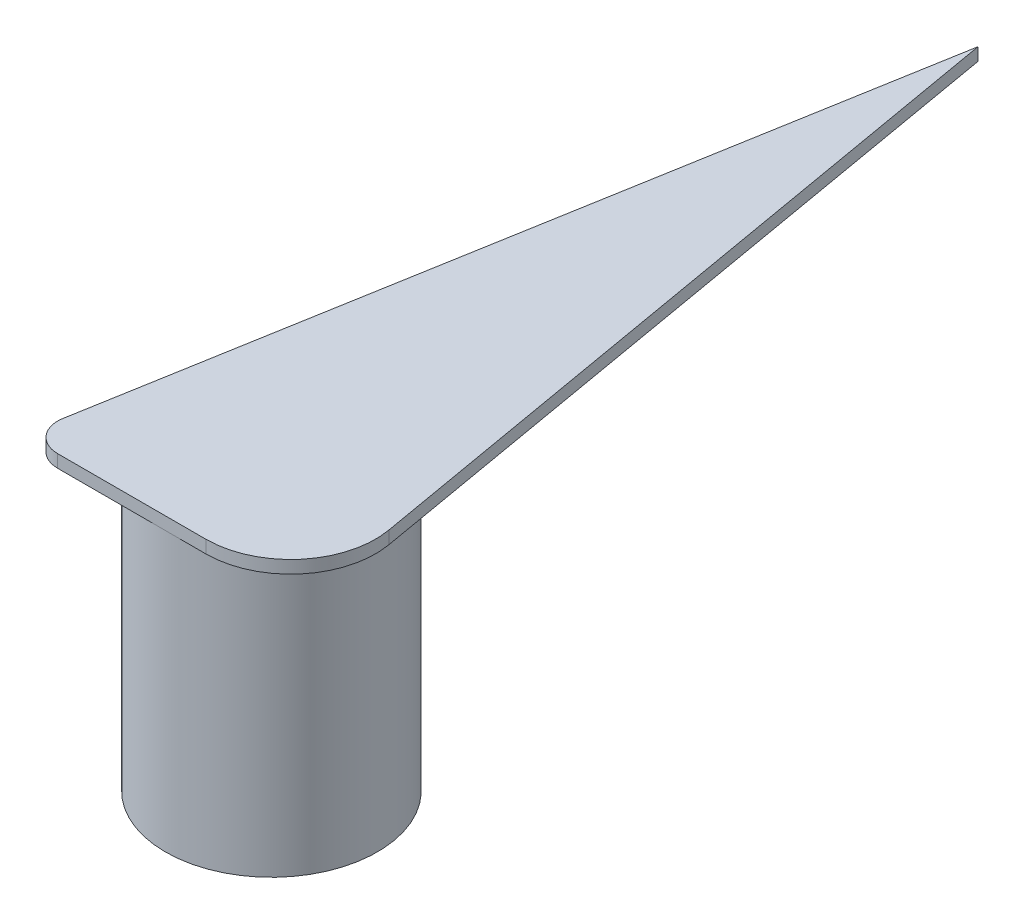
ISO-10303-21;
HEADER;
FILE_DESCRIPTION(('STEP AP214'),'2;1');
FILE_NAME('part.step','',(''),(''),'','','');
FILE_SCHEMA(('AUTOMOTIVE_DESIGN { 1 0 10303 214 1 1 1 1 }'));
ENDSEC;
DATA;
#1=APPLICATION_CONTEXT('core data for automotive mechanical design processes');
#2=APPLICATION_PROTOCOL_DEFINITION('international standard','automotive_design',2000,#1);
#3=PRODUCT_CONTEXT('',#1,'mechanical');
#4=PRODUCT('Part','Part','',(#3));
#5=PRODUCT_RELATED_PRODUCT_CATEGORY('part','',(#4));
#6=PRODUCT_DEFINITION_FORMATION('','',#4);
#7=PRODUCT_DEFINITION_CONTEXT('part definition',#1,'design');
#8=PRODUCT_DEFINITION('design','',#6,#7);
#9=PRODUCT_DEFINITION_SHAPE('','',#8);
#10=(LENGTH_UNIT() NAMED_UNIT(*) SI_UNIT(.MILLI.,.METRE.));
#11=(NAMED_UNIT(*) PLANE_ANGLE_UNIT() SI_UNIT($,.RADIAN.));
#12=(NAMED_UNIT(*) SI_UNIT($,.STERADIAN.) SOLID_ANGLE_UNIT());
#13=UNCERTAINTY_MEASURE_WITH_UNIT(LENGTH_MEASURE(1.E-05),#10,'distance_accuracy_value','');
#14=(GEOMETRIC_REPRESENTATION_CONTEXT(3) GLOBAL_UNCERTAINTY_ASSIGNED_CONTEXT((#13)) GLOBAL_UNIT_ASSIGNED_CONTEXT((#10,
#11,#12)) REPRESENTATION_CONTEXT('',''));
#15=CARTESIAN_POINT('',(0.,0.,0.));
#16=DIRECTION('',(0.,0.,1.));
#17=DIRECTION('',(1.,0.,0.));
#18=AXIS2_PLACEMENT_3D('',#15,#16,#17);
#19=CARTESIAN_POINT('',(0.,1.8,0.));
#20=DIRECTION('',(0.,-1.,0.));
#21=DIRECTION('',(0.,0.,-1.));
#22=AXIS2_PLACEMENT_3D('',#19,#20,#21);
#23=CYLINDRICAL_SURFACE('',#22,7.5);
#24=CARTESIAN_POINT('',(0.,0.9,0.));
#25=DIRECTION('',(0.,-1.,0.));
#26=DIRECTION('',(0.,0.,-1.));
#27=AXIS2_PLACEMENT_3D('',#24,#25,#26);
#28=CIRCLE('',#27,7.5);
#29=CARTESIAN_POINT('',(0.,0.9,7.5));
#30=VERTEX_POINT('',#29);
#31=EDGE_CURVE('E133',#30,#30,#28,.T.);
#32=ORIENTED_EDGE('',*,*,#31,.T.);
#33=EDGE_LOOP('',(#32));
#34=FACE_BOUND('',#33,.T.);
#35=CARTESIAN_POINT('',(0.,-18.8,0.));
#36=DIRECTION('',(0.,1.,0.));
#37=DIRECTION('',(0.,0.,1.));
#38=AXIS2_PLACEMENT_3D('',#35,#36,#37);
#39=CIRCLE('',#38,7.5);
#40=CARTESIAN_POINT('',(0.,-18.8,7.5));
#41=VERTEX_POINT('',#40);
#42=EDGE_CURVE('E110',#41,#41,#39,.T.);
#43=ORIENTED_EDGE('',*,*,#42,.T.);
#44=EDGE_LOOP('',(#43));
#45=FACE_BOUND('',#44,.T.);
#46=ADVANCED_FACE('F39',(#34,#45),#23,.T.);
#47=CARTESIAN_POINT('',(0.,-18.8,0.));
#48=DIRECTION('',(0.,1.,0.));
#49=DIRECTION('',(0.,0.,1.));
#50=AXIS2_PLACEMENT_3D('',#47,#48,#49);
#51=PLANE('',#50);
#52=ORIENTED_EDGE('',*,*,#42,.F.);
#53=EDGE_LOOP('',(#52));
#54=FACE_BOUND('',#53,.T.);
#55=ADVANCED_FACE('F168',(#54),#51,.F.);
#56=CARTESIAN_POINT('',(-10.,0.9,7.5));
#57=DIRECTION('',(0.,0.,1.));
#58=DIRECTION('',(1.,0.,0.));
#59=AXIS2_PLACEMENT_3D('',#56,#57,#58);
#60=PLANE('',#59);
#61=DIRECTION('',(1.,0.,0.));
#62=VECTOR('',#61,1.);
#63=CARTESIAN_POINT('',(-10.,1.8,7.5));
#64=LINE('',#63,#62);
#65=CARTESIAN_POINT('',(-7.62215347305587,1.8,7.5));
#66=VERTEX_POINT('',#65);
#67=CARTESIAN_POINT('',(2.86646041916761,1.8,7.5));
#68=VERTEX_POINT('',#67);
#69=EDGE_CURVE('E101',#66,#68,#64,.T.);
#70=ORIENTED_EDGE('',*,*,#69,.F.);
#71=DIRECTION('',(0.,1.,0.));
#72=VECTOR('',#71,1.);
#73=CARTESIAN_POINT('',(-7.62215347305587,0.9,7.5));
#74=LINE('',#73,#72);
#75=CARTESIAN_POINT('',(-7.62215347305587,0.9,7.5));
#76=VERTEX_POINT('',#75);
#77=EDGE_CURVE('E48',#66,#76,#74,.F.);
#78=ORIENTED_EDGE('',*,*,#77,.T.);
#79=DIRECTION('',(1.,0.,0.));
#80=VECTOR('',#79,1.);
#81=CARTESIAN_POINT('',(-10.,0.9,7.5));
#82=LINE('',#81,#80);
#83=EDGE_CURVE('E111',#76,#30,#82,.T.);
#84=ORIENTED_EDGE('',*,*,#83,.T.);
#85=CARTESIAN_POINT('',(2.86646041916761,0.9,7.5));
#86=VERTEX_POINT('',#85);
#87=EDGE_CURVE('E116',#30,#86,#82,.T.);
#88=ORIENTED_EDGE('',*,*,#87,.T.);
#89=DIRECTION('',(0.,1.,0.));
#90=VECTOR('',#89,1.);
#91=CARTESIAN_POINT('',(2.86646041916761,0.9,7.5));
#92=LINE('',#91,#90);
#93=EDGE_CURVE('E137',#86,#68,#92,.T.);
#94=ORIENTED_EDGE('',*,*,#93,.T.);
#95=EDGE_LOOP('',(#70,#78,#84,#88,#94));
#96=FACE_BOUND('',#95,.T.);
#97=ADVANCED_FACE('F162',(#96),#60,.T.);
#98=CARTESIAN_POINT('',(10.,0.9,7.5));
#99=DIRECTION('',(0.985211754819674,0.,-0.171341174751248));
#100=DIRECTION('',(-0.171341174751248,0.,-0.985211754819674));
#101=AXIS2_PLACEMENT_3D('',#98,#99,#100);
#102=PLANE('',#101);
#103=DIRECTION('',(-0.171341174751248,0.,-0.985211754819674));
#104=VECTOR('',#103,1.);
#105=CARTESIAN_POINT('',(10.,1.8,7.5));
#106=LINE('',#105,#104);
#107=CARTESIAN_POINT('',(8.77773094808565,1.8,0.471952951492514));
#108=VERTEX_POINT('',#107);
#109=CARTESIAN_POINT('',(0.,1.8,-50.));
#110=VERTEX_POINT('',#109);
#111=EDGE_CURVE('E123',#108,#110,#106,.T.);
#112=ORIENTED_EDGE('',*,*,#111,.F.);
#113=DIRECTION('',(0.,1.,0.));
#114=VECTOR('',#113,1.);
#115=CARTESIAN_POINT('',(8.77773094808565,0.9,0.471952951492513));
#116=LINE('',#115,#114);
#117=CARTESIAN_POINT('',(8.77773094808565,0.9,0.471952951492514));
#118=VERTEX_POINT('',#117);
#119=EDGE_CURVE('E95',#108,#118,#116,.F.);
#120=ORIENTED_EDGE('',*,*,#119,.T.);
#121=DIRECTION('',(-0.171341174751248,0.,-0.985211754819674));
#122=VECTOR('',#121,1.);
#123=CARTESIAN_POINT('',(10.,0.9,7.5));
#124=LINE('',#123,#122);
#125=CARTESIAN_POINT('',(0.,0.9,-50.));
#126=VERTEX_POINT('',#125);
#127=EDGE_CURVE('E88',#118,#126,#124,.T.);
#128=ORIENTED_EDGE('',*,*,#127,.T.);
#129=DIRECTION('',(0.,1.,0.));
#130=VECTOR('',#129,1.);
#131=CARTESIAN_POINT('',(0.,0.9,-50.));
#132=LINE('',#131,#130);
#133=EDGE_CURVE('E92',#126,#110,#132,.T.);
#134=ORIENTED_EDGE('',*,*,#133,.T.);
#135=EDGE_LOOP('',(#112,#120,#128,#134));
#136=FACE_BOUND('',#135,.T.);
#137=ADVANCED_FACE('F91',(#136),#102,.T.);
#138=CARTESIAN_POINT('',(0.,0.9,-50.));
#139=DIRECTION('',(-0.985211754819674,0.,-0.171341174751248));
#140=DIRECTION('',(-0.171341174751248,0.,0.985211754819674));
#141=AXIS2_PLACEMENT_3D('',#138,#139,#140);
#142=PLANE('',#141);
#143=DIRECTION('',(-0.171341174751248,0.,0.985211754819674));
#144=VECTOR('',#143,1.);
#145=CARTESIAN_POINT('',(0.,0.9,-50.));
#146=LINE('',#145,#144);
#147=CARTESIAN_POINT('',(-9.59257698269522,0.9,5.15731765049749));
#148=VERTEX_POINT('',#147);
#149=EDGE_CURVE('E100',#126,#148,#146,.T.);
#150=ORIENTED_EDGE('',*,*,#149,.T.);
#151=DIRECTION('',(0.,1.,0.));
#152=VECTOR('',#151,1.);
#153=CARTESIAN_POINT('',(-9.59257698269522,0.9,5.1573176504975));
#154=LINE('',#153,#152);
#155=CARTESIAN_POINT('',(-9.59257698269522,1.8,5.15731765049749));
#156=VERTEX_POINT('',#155);
#157=EDGE_CURVE('E149',#148,#156,#154,.T.);
#158=ORIENTED_EDGE('',*,*,#157,.T.);
#159=DIRECTION('',(-0.171341174751248,0.,0.985211754819674));
#160=VECTOR('',#159,1.);
#161=CARTESIAN_POINT('',(0.,1.8,-50.));
#162=LINE('',#161,#160);
#163=EDGE_CURVE('E108',#110,#156,#162,.T.);
#164=ORIENTED_EDGE('',*,*,#163,.F.);
#165=ORIENTED_EDGE('',*,*,#133,.F.);
#166=EDGE_LOOP('',(#150,#158,#164,#165));
#167=FACE_BOUND('',#166,.T.);
#168=ADVANCED_FACE('F105',(#167),#142,.T.);
#169=CARTESIAN_POINT('',(0.,0.9,0.));
#170=DIRECTION('',(0.,-1.,0.));
#171=DIRECTION('',(0.,0.,-1.));
#172=AXIS2_PLACEMENT_3D('',#169,#170,#171);
#173=PLANE('',#172);
#174=ORIENTED_EDGE('',*,*,#83,.F.);
#175=CARTESIAN_POINT('',(-7.62215347305587,0.9,5.5));
#176=DIRECTION('',(0.,-1.,0.));
#177=DIRECTION('',(0.,0.,-1.));
#178=AXIS2_PLACEMENT_3D('',#175,#176,#177);
#179=CIRCLE('',#178,2.);
#180=EDGE_CURVE('E11',#76,#148,#179,.T.);
#181=ORIENTED_EDGE('',*,*,#180,.T.);
#182=ORIENTED_EDGE('',*,*,#149,.F.);
#183=ORIENTED_EDGE('',*,*,#127,.F.);
#184=CARTESIAN_POINT('',(2.86646041916761,0.9,1.5));
#185=DIRECTION('',(0.,-1.,0.));
#186=DIRECTION('',(0.,0.,-1.));
#187=AXIS2_PLACEMENT_3D('',#184,#185,#186);
#188=CIRCLE('',#187,6.);
#189=EDGE_CURVE('E146',#118,#86,#188,.T.);
#190=ORIENTED_EDGE('',*,*,#189,.T.);
#191=ORIENTED_EDGE('',*,*,#87,.F.);
#192=ORIENTED_EDGE('',*,*,#31,.F.);
#193=EDGE_LOOP('',(#174,#181,#182,#183,#190,#191,#192));
#194=FACE_BOUND('',#193,.T.);
#195=ADVANCED_FACE('F113',(#194),#173,.T.);
#196=CARTESIAN_POINT('',(0.,1.8,0.));
#197=DIRECTION('',(0.,1.,0.));
#198=DIRECTION('',(0.,0.,1.));
#199=AXIS2_PLACEMENT_3D('',#196,#197,#198);
#200=PLANE('',#199);
#201=ORIENTED_EDGE('',*,*,#163,.T.);
#202=CARTESIAN_POINT('',(-7.62215347305587,1.8,5.5));
#203=DIRECTION('',(0.,1.,0.));
#204=DIRECTION('',(0.,0.,1.));
#205=AXIS2_PLACEMENT_3D('',#202,#203,#204);
#206=CIRCLE('',#205,2.);
#207=EDGE_CURVE('E62',#156,#66,#206,.T.);
#208=ORIENTED_EDGE('',*,*,#207,.T.);
#209=ORIENTED_EDGE('',*,*,#69,.T.);
#210=CARTESIAN_POINT('',(2.86646041916761,1.8,1.5));
#211=DIRECTION('',(0.,1.,0.));
#212=DIRECTION('',(0.,0.,1.));
#213=AXIS2_PLACEMENT_3D('',#210,#211,#212);
#214=CIRCLE('',#213,6.);
#215=EDGE_CURVE('E141',#68,#108,#214,.T.);
#216=ORIENTED_EDGE('',*,*,#215,.T.);
#217=ORIENTED_EDGE('',*,*,#111,.T.);
#218=EDGE_LOOP('',(#201,#208,#209,#216,#217));
#219=FACE_BOUND('',#218,.T.);
#220=ADVANCED_FACE('F155',(#219),#200,.T.);
#221=CARTESIAN_POINT('',(2.86646041916761,0.9,1.5));
#222=DIRECTION('',(0.,1.,0.));
#223=DIRECTION('',(0.,0.,1.));
#224=AXIS2_PLACEMENT_3D('',#221,#222,#223);
#225=CYLINDRICAL_SURFACE('',#224,6.);
#226=ORIENTED_EDGE('',*,*,#189,.F.);
#227=ORIENTED_EDGE('',*,*,#119,.F.);
#228=ORIENTED_EDGE('',*,*,#215,.F.);
#229=ORIENTED_EDGE('',*,*,#93,.F.);
#230=EDGE_LOOP('',(#226,#227,#228,#229));
#231=FACE_BOUND('',#230,.T.);
#232=ADVANCED_FACE('F158',(#231),#225,.T.);
#233=CARTESIAN_POINT('',(-7.62215347305587,0.9,5.5));
#234=DIRECTION('',(0.,1.,0.));
#235=DIRECTION('',(0.,0.,1.));
#236=AXIS2_PLACEMENT_3D('',#233,#234,#235);
#237=CYLINDRICAL_SURFACE('',#236,2.);
#238=ORIENTED_EDGE('',*,*,#180,.F.);
#239=ORIENTED_EDGE('',*,*,#77,.F.);
#240=ORIENTED_EDGE('',*,*,#207,.F.);
#241=ORIENTED_EDGE('',*,*,#157,.F.);
#242=EDGE_LOOP('',(#238,#239,#240,#241));
#243=FACE_BOUND('',#242,.T.);
#244=ADVANCED_FACE('F41',(#243),#237,.T.);
#245=CLOSED_SHELL('',(#46,#55,#97,#137,#168,#195,#220,#232,#244));
#246=MANIFOLD_SOLID_BREP('B2',#245);
#247=ADVANCED_BREP_SHAPE_REPRESENTATION('',(#18,#246),#14);
#248=SHAPE_DEFINITION_REPRESENTATION(#9,#247);
ENDSEC;
END-ISO-10303-21;
